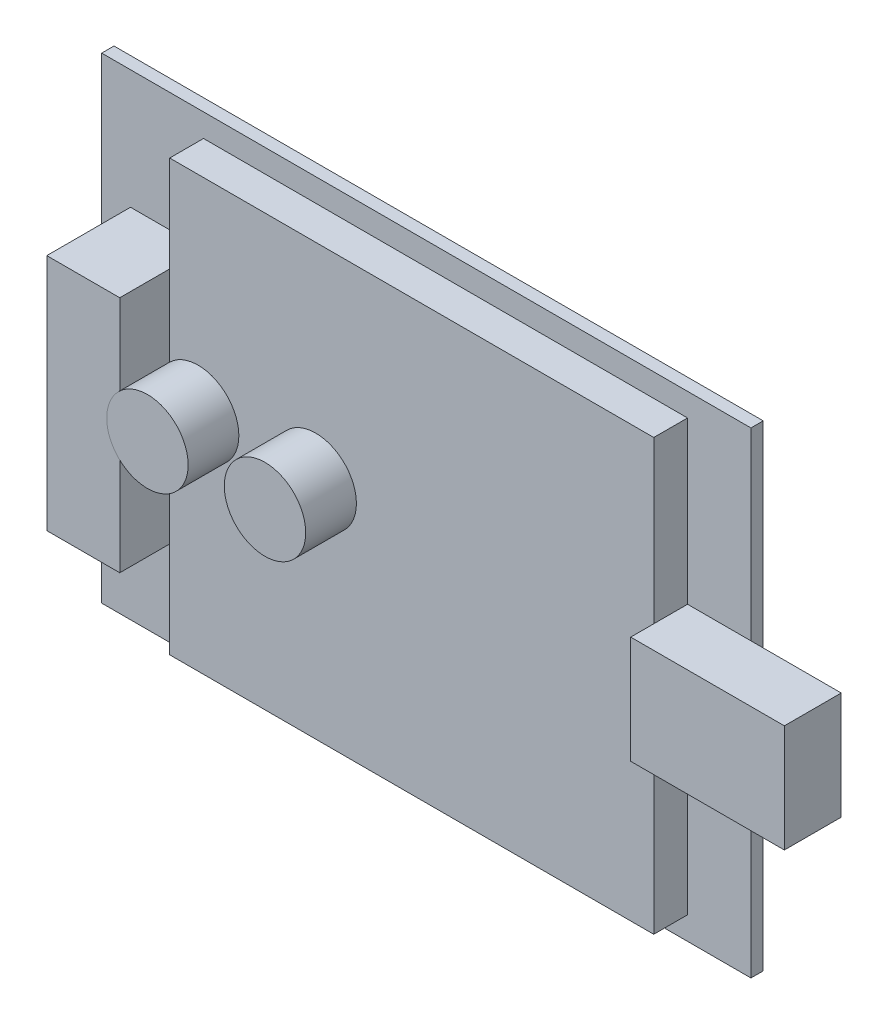
ISO-10303-21;
HEADER;
FILE_DESCRIPTION(('STEP AP214'),'2;1');
FILE_NAME('part.step','',(''),(''),'','','');
FILE_SCHEMA(('AUTOMOTIVE_DESIGN { 1 0 10303 214 1 1 1 1 }'));
ENDSEC;
DATA;
#1=APPLICATION_CONTEXT('core data for automotive mechanical design processes');
#2=APPLICATION_PROTOCOL_DEFINITION('international standard','automotive_design',2000,#1);
#3=PRODUCT_CONTEXT('',#1,'mechanical');
#4=PRODUCT('Part','Part','',(#3));
#5=PRODUCT_RELATED_PRODUCT_CATEGORY('part','',(#4));
#6=PRODUCT_DEFINITION_FORMATION('','',#4);
#7=PRODUCT_DEFINITION_CONTEXT('part definition',#1,'design');
#8=PRODUCT_DEFINITION('design','',#6,#7);
#9=PRODUCT_DEFINITION_SHAPE('','',#8);
#10=(LENGTH_UNIT() NAMED_UNIT(*) SI_UNIT(.MILLI.,.METRE.));
#11=(NAMED_UNIT(*) PLANE_ANGLE_UNIT() SI_UNIT($,.RADIAN.));
#12=(NAMED_UNIT(*) SI_UNIT($,.STERADIAN.) SOLID_ANGLE_UNIT());
#13=UNCERTAINTY_MEASURE_WITH_UNIT(LENGTH_MEASURE(1.E-05),#10,'distance_accuracy_value','');
#14=(GEOMETRIC_REPRESENTATION_CONTEXT(3) GLOBAL_UNCERTAINTY_ASSIGNED_CONTEXT((#13)) GLOBAL_UNIT_ASSIGNED_CONTEXT((#10,
#11,#12)) REPRESENTATION_CONTEXT('',''));
#15=CARTESIAN_POINT('',(0.,0.,0.));
#16=DIRECTION('',(0.,0.,1.));
#17=DIRECTION('',(1.,0.,0.));
#18=AXIS2_PLACEMENT_3D('',#15,#16,#17);
#19=CARTESIAN_POINT('',(-29.,-15.5,12.5));
#20=DIRECTION('',(-1.,0.,0.));
#21=DIRECTION('',(0.,0.,1.));
#22=AXIS2_PLACEMENT_3D('',#19,#20,#21);
#23=PLANE('',#22);
#24=DIRECTION('',(0.,0.,-1.));
#25=VECTOR('',#24,1.);
#26=CARTESIAN_POINT('',(-29.,4.99473319220205,12.6));
#27=LINE('',#26,#25);
#28=CARTESIAN_POINT('',(-29.,4.99473319220205,6.));
#29=VERTEX_POINT('',#28);
#30=CARTESIAN_POINT('',(-29.,4.99473319220205,12.5));
#31=VERTEX_POINT('',#30);
#32=EDGE_CURVE('E210',#29,#31,#27,.F.);
#33=ORIENTED_EDGE('',*,*,#32,.F.);
#34=DIRECTION('',(0.,-1.,0.));
#35=VECTOR('',#34,1.);
#36=CARTESIAN_POINT('',(-29.,28.,6.));
#37=LINE('',#36,#35);
#38=CARTESIAN_POINT('',(-29.,15.5,6.));
#39=VERTEX_POINT('',#38);
#40=EDGE_CURVE('E216',#39,#29,#37,.T.);
#41=ORIENTED_EDGE('',*,*,#40,.F.);
#42=DIRECTION('',(0.,0.,-1.));
#43=VECTOR('',#42,1.);
#44=CARTESIAN_POINT('',(-29.,15.5,12.5));
#45=LINE('',#44,#43);
#46=CARTESIAN_POINT('',(-29.,15.5,12.5));
#47=VERTEX_POINT('',#46);
#48=EDGE_CURVE('E311',#47,#39,#45,.T.);
#49=ORIENTED_EDGE('',*,*,#48,.F.);
#50=DIRECTION('',(0.,1.,0.));
#51=VECTOR('',#50,1.);
#52=CARTESIAN_POINT('',(-29.,-15.5,12.5));
#53=LINE('',#52,#51);
#54=EDGE_CURVE('E217',#31,#47,#53,.T.);
#55=ORIENTED_EDGE('',*,*,#54,.F.);
#56=EDGE_LOOP('',(#33,#41,#49,#55));
#57=FACE_BOUND('',#56,.T.);
#58=ADVANCED_FACE('F39',(#57),#23,.F.);
#59=DIRECTION('',(0.,0.,-1.));
#60=VECTOR('',#59,1.);
#61=CARTESIAN_POINT('',(-29.,-2.59473319220205,12.6));
#62=LINE('',#61,#60);
#63=CARTESIAN_POINT('',(-29.,-2.59473319220205,12.5));
#64=VERTEX_POINT('',#63);
#65=CARTESIAN_POINT('',(-29.,-2.59473319220205,6.));
#66=VERTEX_POINT('',#65);
#67=EDGE_CURVE('E54',#64,#66,#62,.T.);
#68=ORIENTED_EDGE('',*,*,#67,.F.);
#69=CARTESIAN_POINT('',(-29.,-15.5,12.5));
#70=VERTEX_POINT('',#69);
#71=EDGE_CURVE('E299',#70,#64,#53,.T.);
#72=ORIENTED_EDGE('',*,*,#71,.F.);
#73=DIRECTION('',(0.,0.,-1.));
#74=VECTOR('',#73,1.);
#75=CARTESIAN_POINT('',(-29.,-15.5,12.5));
#76=LINE('',#75,#74);
#77=CARTESIAN_POINT('',(-29.,-15.5,6.));
#78=VERTEX_POINT('',#77);
#79=EDGE_CURVE('E316',#70,#78,#76,.T.);
#80=ORIENTED_EDGE('',*,*,#79,.T.);
#81=EDGE_CURVE('E223',#66,#78,#37,.T.);
#82=ORIENTED_EDGE('',*,*,#81,.F.);
#83=EDGE_LOOP('',(#68,#72,#80,#82));
#84=FACE_BOUND('',#83,.T.);
#85=ADVANCED_FACE('F428',(#84),#23,.F.);
#86=CARTESIAN_POINT('',(34.,-28.,6.));
#87=DIRECTION('',(-1.,0.,0.));
#88=DIRECTION('',(0.,0.,1.));
#89=AXIS2_PLACEMENT_3D('',#86,#87,#88);
#90=PLANE('',#89);
#91=DIRECTION('',(0.,0.,-1.));
#92=VECTOR('',#91,1.);
#93=CARTESIAN_POINT('',(34.,-7.,9.));
#94=LINE('',#93,#92);
#95=CARTESIAN_POINT('',(34.,-7.,6.));
#96=VERTEX_POINT('',#95);
#97=CARTESIAN_POINT('',(34.,-7.,1.6));
#98=VERTEX_POINT('',#97);
#99=EDGE_CURVE('E366',#96,#98,#94,.T.);
#100=ORIENTED_EDGE('',*,*,#99,.F.);
#101=DIRECTION('',(0.,1.,0.));
#102=VECTOR('',#101,1.);
#103=CARTESIAN_POINT('',(34.,-28.,6.));
#104=LINE('',#103,#102);
#105=CARTESIAN_POINT('',(34.,-28.,6.));
#106=VERTEX_POINT('',#105);
#107=EDGE_CURVE('E504',#106,#96,#104,.T.);
#108=ORIENTED_EDGE('',*,*,#107,.F.);
#109=DIRECTION('',(0.,0.,-1.));
#110=VECTOR('',#109,1.);
#111=CARTESIAN_POINT('',(34.,-28.,6.));
#112=LINE('',#111,#110);
#113=CARTESIAN_POINT('',(34.,-28.,1.6));
#114=VERTEX_POINT('',#113);
#115=EDGE_CURVE('E253',#106,#114,#112,.T.);
#116=ORIENTED_EDGE('',*,*,#115,.T.);
#117=DIRECTION('',(0.,1.,0.));
#118=VECTOR('',#117,1.);
#119=CARTESIAN_POINT('',(34.,-28.,1.6));
#120=LINE('',#119,#118);
#121=EDGE_CURVE('E233',#114,#98,#120,.T.);
#122=ORIENTED_EDGE('',*,*,#121,.T.);
#123=EDGE_LOOP('',(#100,#108,#116,#122));
#124=FACE_BOUND('',#123,.T.);
#125=ADVANCED_FACE('F432',(#124),#90,.F.);
#126=CARTESIAN_POINT('',(-42.25,31.,1.6));
#127=DIRECTION('',(1.,0.,0.));
#128=DIRECTION('',(0.,0.,-1.));
#129=AXIS2_PLACEMENT_3D('',#126,#127,#128);
#130=PLANE('',#129);
#131=DIRECTION('',(0.,-1.,0.));
#132=VECTOR('',#131,1.);
#133=CARTESIAN_POINT('',(-42.25,31.,0.));
#134=LINE('',#133,#132);
#135=CARTESIAN_POINT('',(-42.25,31.,0.));
#136=VERTEX_POINT('',#135);
#137=CARTESIAN_POINT('',(-42.25,-31.,0.));
#138=VERTEX_POINT('',#137);
#139=EDGE_CURVE('E325',#136,#138,#134,.T.);
#140=ORIENTED_EDGE('',*,*,#139,.T.);
#141=DIRECTION('',(0.,0.,-1.));
#142=VECTOR('',#141,1.);
#143=CARTESIAN_POINT('',(-42.25,-31.,1.6));
#144=LINE('',#143,#142);
#145=CARTESIAN_POINT('',(-42.25,-31.,1.6));
#146=VERTEX_POINT('',#145);
#147=EDGE_CURVE('E354',#146,#138,#144,.T.);
#148=ORIENTED_EDGE('',*,*,#147,.F.);
#149=DIRECTION('',(0.,-1.,0.));
#150=VECTOR('',#149,1.);
#151=CARTESIAN_POINT('',(-42.25,31.,1.6));
#152=LINE('',#151,#150);
#153=CARTESIAN_POINT('',(-42.25,31.,1.6));
#154=VERTEX_POINT('',#153);
#155=EDGE_CURVE('E323',#154,#146,#152,.T.);
#156=ORIENTED_EDGE('',*,*,#155,.F.);
#157=DIRECTION('',(0.,0.,-1.));
#158=VECTOR('',#157,1.);
#159=CARTESIAN_POINT('',(-42.25,31.,1.6));
#160=LINE('',#159,#158);
#161=EDGE_CURVE('E338',#154,#136,#160,.T.);
#162=ORIENTED_EDGE('',*,*,#161,.T.);
#163=EDGE_LOOP('',(#140,#148,#156,#162));
#164=FACE_BOUND('',#163,.T.);
#165=ADVANCED_FACE('F41',(#164),#130,.F.);
#166=CARTESIAN_POINT('',(-42.25,-31.,1.6));
#167=DIRECTION('',(0.,1.,0.));
#168=DIRECTION('',(0.,0.,1.));
#169=AXIS2_PLACEMENT_3D('',#166,#167,#168);
#170=PLANE('',#169);
#171=DIRECTION('',(1.,0.,0.));
#172=VECTOR('',#171,1.);
#173=CARTESIAN_POINT('',(-42.25,-31.,0.));
#174=LINE('',#173,#172);
#175=CARTESIAN_POINT('',(42.25,-31.,0.));
#176=VERTEX_POINT('',#175);
#177=EDGE_CURVE('E340',#138,#176,#174,.T.);
#178=ORIENTED_EDGE('',*,*,#177,.T.);
#179=DIRECTION('',(0.,0.,-1.));
#180=VECTOR('',#179,1.);
#181=CARTESIAN_POINT('',(42.25,-31.,1.6));
#182=LINE('',#181,#180);
#183=CARTESIAN_POINT('',(42.25,-31.,1.6));
#184=VERTEX_POINT('',#183);
#185=EDGE_CURVE('E349',#184,#176,#182,.T.);
#186=ORIENTED_EDGE('',*,*,#185,.F.);
#187=DIRECTION('',(1.,0.,0.));
#188=VECTOR('',#187,1.);
#189=CARTESIAN_POINT('',(-42.25,-31.,1.6));
#190=LINE('',#189,#188);
#191=EDGE_CURVE('E326',#146,#184,#190,.T.);
#192=ORIENTED_EDGE('',*,*,#191,.F.);
#193=ORIENTED_EDGE('',*,*,#147,.T.);
#194=EDGE_LOOP('',(#178,#186,#192,#193));
#195=FACE_BOUND('',#194,.T.);
#196=ADVANCED_FACE('F464',(#195),#170,.F.);
#197=CARTESIAN_POINT('',(42.25,-31.,1.6));
#198=DIRECTION('',(-1.,0.,0.));
#199=DIRECTION('',(0.,0.,1.));
#200=AXIS2_PLACEMENT_3D('',#197,#198,#199);
#201=PLANE('',#200);
#202=DIRECTION('',(0.,1.,0.));
#203=VECTOR('',#202,1.);
#204=CARTESIAN_POINT('',(42.25,-31.,0.));
#205=LINE('',#204,#203);
#206=CARTESIAN_POINT('',(42.25,31.,0.));
#207=VERTEX_POINT('',#206);
#208=EDGE_CURVE('E341',#176,#207,#205,.T.);
#209=ORIENTED_EDGE('',*,*,#208,.T.);
#210=DIRECTION('',(0.,0.,-1.));
#211=VECTOR('',#210,1.);
#212=CARTESIAN_POINT('',(42.25,31.,1.6));
#213=LINE('',#212,#211);
#214=CARTESIAN_POINT('',(42.25,31.,1.6));
#215=VERTEX_POINT('',#214);
#216=EDGE_CURVE('E347',#215,#207,#213,.T.);
#217=ORIENTED_EDGE('',*,*,#216,.F.);
#218=DIRECTION('',(0.,1.,0.));
#219=VECTOR('',#218,1.);
#220=CARTESIAN_POINT('',(42.25,-31.,1.6));
#221=LINE('',#220,#219);
#222=CARTESIAN_POINT('',(42.25,7.,1.6));
#223=VERTEX_POINT('',#222);
#224=EDGE_CURVE('E328',#223,#215,#221,.T.);
#225=ORIENTED_EDGE('',*,*,#224,.F.);
#226=CARTESIAN_POINT('',(42.25,-7.,1.6));
#227=VERTEX_POINT('',#226);
#228=EDGE_CURVE('E331',#227,#223,#221,.T.);
#229=ORIENTED_EDGE('',*,*,#228,.F.);
#230=EDGE_CURVE('E329',#184,#227,#221,.T.);
#231=ORIENTED_EDGE('',*,*,#230,.F.);
#232=ORIENTED_EDGE('',*,*,#185,.T.);
#233=EDGE_LOOP('',(#209,#217,#225,#229,#231,#232));
#234=FACE_BOUND('',#233,.T.);
#235=ADVANCED_FACE('F459',(#234),#201,.F.);
#236=CARTESIAN_POINT('',(42.25,31.,1.6));
#237=DIRECTION('',(0.,-1.,0.));
#238=DIRECTION('',(0.,0.,-1.));
#239=AXIS2_PLACEMENT_3D('',#236,#237,#238);
#240=PLANE('',#239);
#241=DIRECTION('',(-1.,0.,0.));
#242=VECTOR('',#241,1.);
#243=CARTESIAN_POINT('',(42.25,31.,0.));
#244=LINE('',#243,#242);
#245=EDGE_CURVE('E330',#207,#136,#244,.T.);
#246=ORIENTED_EDGE('',*,*,#245,.T.);
#247=ORIENTED_EDGE('',*,*,#161,.F.);
#248=DIRECTION('',(-1.,0.,0.));
#249=VECTOR('',#248,1.);
#250=CARTESIAN_POINT('',(42.25,31.,1.6));
#251=LINE('',#250,#249);
#252=EDGE_CURVE('E334',#215,#154,#251,.T.);
#253=ORIENTED_EDGE('',*,*,#252,.F.);
#254=ORIENTED_EDGE('',*,*,#216,.T.);
#255=EDGE_LOOP('',(#246,#247,#253,#254));
#256=FACE_BOUND('',#255,.T.);
#257=ADVANCED_FACE('F455',(#256),#240,.F.);
#258=CARTESIAN_POINT('',(0.,0.,1.6));
#259=DIRECTION('',(0.,0.,1.));
#260=DIRECTION('',(1.,0.,0.));
#261=AXIS2_PLACEMENT_3D('',#258,#259,#260);
#262=PLANE('',#261);
#263=DIRECTION('',(-1.,0.,0.));
#264=VECTOR('',#263,1.);
#265=CARTESIAN_POINT('',(54.,7.,1.6));
#266=LINE('',#265,#264);
#267=CARTESIAN_POINT('',(34.,7.,1.6));
#268=VERTEX_POINT('',#267);
#269=EDGE_CURVE('E64',#223,#268,#266,.T.);
#270=ORIENTED_EDGE('',*,*,#269,.F.);
#271=ORIENTED_EDGE('',*,*,#224,.T.);
#272=ORIENTED_EDGE('',*,*,#252,.T.);
#273=ORIENTED_EDGE('',*,*,#155,.T.);
#274=ORIENTED_EDGE('',*,*,#191,.T.);
#275=ORIENTED_EDGE('',*,*,#230,.T.);
#276=DIRECTION('',(1.,0.,0.));
#277=VECTOR('',#276,1.);
#278=CARTESIAN_POINT('',(34.,-7.,1.6));
#279=LINE('',#278,#277);
#280=EDGE_CURVE('E389',#98,#227,#279,.T.);
#281=ORIENTED_EDGE('',*,*,#280,.F.);
#282=ORIENTED_EDGE('',*,*,#121,.F.);
#283=DIRECTION('',(1.,0.,0.));
#284=VECTOR('',#283,1.);
#285=CARTESIAN_POINT('',(-29.,-28.,1.6));
#286=LINE('',#285,#284);
#287=CARTESIAN_POINT('',(-29.,-28.,1.6));
#288=VERTEX_POINT('',#287);
#289=EDGE_CURVE('E362',#288,#114,#286,.T.);
#290=ORIENTED_EDGE('',*,*,#289,.F.);
#291=DIRECTION('',(0.,-1.,0.));
#292=VECTOR('',#291,1.);
#293=CARTESIAN_POINT('',(-29.,28.,1.6));
#294=LINE('',#293,#292);
#295=CARTESIAN_POINT('',(-29.,-15.5,1.6));
#296=VERTEX_POINT('',#295);
#297=EDGE_CURVE('E48',#296,#288,#294,.T.);
#298=ORIENTED_EDGE('',*,*,#297,.F.);
#299=DIRECTION('',(1.,0.,0.));
#300=VECTOR('',#299,1.);
#301=CARTESIAN_POINT('',(-38.5,-15.5,1.6));
#302=LINE('',#301,#300);
#303=CARTESIAN_POINT('',(-38.5,-15.5,1.6));
#304=VERTEX_POINT('',#303);
#305=EDGE_CURVE('E304',#304,#296,#302,.T.);
#306=ORIENTED_EDGE('',*,*,#305,.F.);
#307=DIRECTION('',(0.,-1.,0.));
#308=VECTOR('',#307,1.);
#309=CARTESIAN_POINT('',(-38.5,15.5,1.6));
#310=LINE('',#309,#308);
#311=CARTESIAN_POINT('',(-38.5,15.5,1.6));
#312=VERTEX_POINT('',#311);
#313=EDGE_CURVE('E289',#312,#304,#310,.T.);
#314=ORIENTED_EDGE('',*,*,#313,.F.);
#315=DIRECTION('',(-1.,0.,0.));
#316=VECTOR('',#315,1.);
#317=CARTESIAN_POINT('',(-29.,15.5,1.6));
#318=LINE('',#317,#316);
#319=CARTESIAN_POINT('',(-29.,15.5,1.6));
#320=VERTEX_POINT('',#319);
#321=EDGE_CURVE('E293',#320,#312,#318,.T.);
#322=ORIENTED_EDGE('',*,*,#321,.F.);
#323=CARTESIAN_POINT('',(-29.,28.,1.6));
#324=VERTEX_POINT('',#323);
#325=EDGE_CURVE('E360',#324,#320,#294,.T.);
#326=ORIENTED_EDGE('',*,*,#325,.F.);
#327=DIRECTION('',(-1.,0.,0.));
#328=VECTOR('',#327,1.);
#329=CARTESIAN_POINT('',(34.,28.,1.6));
#330=LINE('',#329,#328);
#331=CARTESIAN_POINT('',(34.,28.,1.6));
#332=VERTEX_POINT('',#331);
#333=EDGE_CURVE('E231',#332,#324,#330,.T.);
#334=ORIENTED_EDGE('',*,*,#333,.F.);
#335=EDGE_CURVE('E244',#268,#332,#120,.T.);
#336=ORIENTED_EDGE('',*,*,#335,.F.);
#337=EDGE_LOOP('',(#270,#271,#272,#273,#274,#275,#281,#282,#290,#298,#306,#314,#322,#326,#334,#336));
#338=FACE_BOUND('',#337,.T.);
#339=ADVANCED_FACE('F450',(#338),#262,.T.);
#340=CARTESIAN_POINT('',(0.,0.,0.));
#341=DIRECTION('',(0.,0.,1.));
#342=DIRECTION('',(1.,0.,0.));
#343=AXIS2_PLACEMENT_3D('',#340,#341,#342);
#344=PLANE('',#343);
#345=DIRECTION('',(-1.,0.,0.));
#346=VECTOR('',#345,1.);
#347=CARTESIAN_POINT('',(-29.,15.5,0.));
#348=LINE('',#347,#346);
#349=CARTESIAN_POINT('',(-29.,15.5,0.));
#350=VERTEX_POINT('',#349);
#351=CARTESIAN_POINT('',(-38.5,15.5,0.));
#352=VERTEX_POINT('',#351);
#353=EDGE_CURVE('E268',#350,#352,#348,.T.);
#354=ORIENTED_EDGE('',*,*,#353,.T.);
#355=DIRECTION('',(0.,-1.,0.));
#356=VECTOR('',#355,1.);
#357=CARTESIAN_POINT('',(-38.5,15.5,0.));
#358=LINE('',#357,#356);
#359=CARTESIAN_POINT('',(-38.5,-15.5,0.));
#360=VERTEX_POINT('',#359);
#361=EDGE_CURVE('E256',#352,#360,#358,.T.);
#362=ORIENTED_EDGE('',*,*,#361,.T.);
#363=DIRECTION('',(1.,0.,0.));
#364=VECTOR('',#363,1.);
#365=CARTESIAN_POINT('',(-38.5,-15.5,0.));
#366=LINE('',#365,#364);
#367=CARTESIAN_POINT('',(-29.,-15.5,0.));
#368=VERTEX_POINT('',#367);
#369=EDGE_CURVE('E261',#360,#368,#366,.T.);
#370=ORIENTED_EDGE('',*,*,#369,.T.);
#371=DIRECTION('',(0.,1.,0.));
#372=VECTOR('',#371,1.);
#373=CARTESIAN_POINT('',(-29.,-15.5,0.));
#374=LINE('',#373,#372);
#375=EDGE_CURVE('E264',#368,#350,#374,.T.);
#376=ORIENTED_EDGE('',*,*,#375,.T.);
#377=EDGE_LOOP('',(#354,#362,#370,#376));
#378=FACE_BOUND('',#377,.T.);
#379=ORIENTED_EDGE('',*,*,#139,.F.);
#380=ORIENTED_EDGE('',*,*,#245,.F.);
#381=ORIENTED_EDGE('',*,*,#208,.F.);
#382=ORIENTED_EDGE('',*,*,#177,.F.);
#383=EDGE_LOOP('',(#379,#380,#381,#382));
#384=FACE_BOUND('',#383,.T.);
#385=ADVANCED_FACE('F449',(#378,#384),#344,.F.);
#386=CARTESIAN_POINT('',(-38.5,15.5,12.5));
#387=DIRECTION('',(1.,0.,0.));
#388=DIRECTION('',(0.,0.,-1.));
#389=AXIS2_PLACEMENT_3D('',#386,#387,#388);
#390=PLANE('',#389);
#391=ORIENTED_EDGE('',*,*,#313,.T.);
#392=DIRECTION('',(0.,0.,-1.));
#393=VECTOR('',#392,1.);
#394=CARTESIAN_POINT('',(-38.5,-15.5,12.5));
#395=LINE('',#394,#393);
#396=CARTESIAN_POINT('',(-38.5,-15.5,12.5));
#397=VERTEX_POINT('',#396);
#398=EDGE_CURVE('E317',#397,#304,#395,.T.);
#399=ORIENTED_EDGE('',*,*,#398,.F.);
#400=DIRECTION('',(0.,-1.,0.));
#401=VECTOR('',#400,1.);
#402=CARTESIAN_POINT('',(-38.5,15.5,12.5));
#403=LINE('',#402,#401);
#404=CARTESIAN_POINT('',(-38.5,15.5,12.5));
#405=VERTEX_POINT('',#404);
#406=EDGE_CURVE('E292',#405,#397,#403,.T.);
#407=ORIENTED_EDGE('',*,*,#406,.F.);
#408=DIRECTION('',(0.,0.,-1.));
#409=VECTOR('',#408,1.);
#410=CARTESIAN_POINT('',(-38.5,15.5,12.5));
#411=LINE('',#410,#409);
#412=EDGE_CURVE('E305',#405,#312,#411,.T.);
#413=ORIENTED_EDGE('',*,*,#412,.T.);
#414=EDGE_LOOP('',(#391,#399,#407,#413));
#415=FACE_BOUND('',#414,.T.);
#416=ADVANCED_FACE('F444',(#415),#390,.F.);
#417=CARTESIAN_POINT('',(-38.5,-15.5,12.5));
#418=DIRECTION('',(0.,1.,0.));
#419=DIRECTION('',(0.,0.,1.));
#420=AXIS2_PLACEMENT_3D('',#417,#418,#419);
#421=PLANE('',#420);
#422=ORIENTED_EDGE('',*,*,#305,.T.);
#423=EDGE_CURVE('E312',#78,#296,#76,.T.);
#424=ORIENTED_EDGE('',*,*,#423,.F.);
#425=ORIENTED_EDGE('',*,*,#79,.F.);
#426=DIRECTION('',(1.,0.,0.));
#427=VECTOR('',#426,1.);
#428=CARTESIAN_POINT('',(-38.5,-15.5,12.5));
#429=LINE('',#428,#427);
#430=EDGE_CURVE('E294',#397,#70,#429,.T.);
#431=ORIENTED_EDGE('',*,*,#430,.F.);
#432=ORIENTED_EDGE('',*,*,#398,.T.);
#433=EDGE_LOOP('',(#422,#424,#425,#431,#432));
#434=FACE_BOUND('',#433,.T.);
#435=ADVANCED_FACE('F439',(#434),#421,.F.);
#436=CARTESIAN_POINT('',(-29.,15.5,12.5));
#437=DIRECTION('',(0.,-1.,0.));
#438=DIRECTION('',(0.,0.,-1.));
#439=AXIS2_PLACEMENT_3D('',#436,#437,#438);
#440=PLANE('',#439);
#441=ORIENTED_EDGE('',*,*,#321,.T.);
#442=ORIENTED_EDGE('',*,*,#412,.F.);
#443=DIRECTION('',(-1.,0.,0.));
#444=VECTOR('',#443,1.);
#445=CARTESIAN_POINT('',(-29.,15.5,12.5));
#446=LINE('',#445,#444);
#447=EDGE_CURVE('E296',#47,#405,#446,.T.);
#448=ORIENTED_EDGE('',*,*,#447,.F.);
#449=ORIENTED_EDGE('',*,*,#48,.T.);
#450=EDGE_CURVE('E315',#39,#320,#45,.T.);
#451=ORIENTED_EDGE('',*,*,#450,.T.);
#452=EDGE_LOOP('',(#441,#442,#448,#449,#451));
#453=FACE_BOUND('',#452,.T.);
#454=ADVANCED_FACE('F437',(#453),#440,.F.);
#455=CARTESIAN_POINT('',(0.,0.,12.5));
#456=DIRECTION('',(0.,0.,1.));
#457=DIRECTION('',(1.,0.,0.));
#458=AXIS2_PLACEMENT_3D('',#455,#456,#457);
#459=PLANE('',#458);
#460=ORIENTED_EDGE('',*,*,#71,.T.);
#461=CARTESIAN_POINT('',(-25.3,1.2,12.5));
#462=DIRECTION('',(0.,0.,1.));
#463=DIRECTION('',(1.,0.,0.));
#464=AXIS2_PLACEMENT_3D('',#461,#462,#463);
#465=CIRCLE('',#464,5.3);
#466=EDGE_CURVE('E218',#64,#31,#465,.F.);
#467=ORIENTED_EDGE('',*,*,#466,.T.);
#468=ORIENTED_EDGE('',*,*,#54,.T.);
#469=ORIENTED_EDGE('',*,*,#447,.T.);
#470=ORIENTED_EDGE('',*,*,#406,.T.);
#471=ORIENTED_EDGE('',*,*,#430,.T.);
#472=EDGE_LOOP('',(#460,#467,#468,#469,#470,#471));
#473=FACE_BOUND('',#472,.T.);
#474=ADVANCED_FACE('F572',(#473),#459,.T.);
#475=CARTESIAN_POINT('',(-38.5,15.5,0.));
#476=DIRECTION('',(1.,0.,0.));
#477=DIRECTION('',(0.,0.,-1.));
#478=AXIS2_PLACEMENT_3D('',#475,#476,#477);
#479=PLANE('',#478);
#480=DIRECTION('',(0.,-1.,0.));
#481=VECTOR('',#480,1.);
#482=CARTESIAN_POINT('',(-38.5,15.5,-2.5));
#483=LINE('',#482,#481);
#484=CARTESIAN_POINT('',(-38.5,15.5,-2.5));
#485=VERTEX_POINT('',#484);
#486=CARTESIAN_POINT('',(-38.5,-15.5,-2.5));
#487=VERTEX_POINT('',#486);
#488=EDGE_CURVE('E260',#485,#487,#483,.T.);
#489=ORIENTED_EDGE('',*,*,#488,.T.);
#490=DIRECTION('',(0.,0.,-1.));
#491=VECTOR('',#490,1.);
#492=CARTESIAN_POINT('',(-38.5,-15.5,0.));
#493=LINE('',#492,#491);
#494=EDGE_CURVE('E290',#360,#487,#493,.T.);
#495=ORIENTED_EDGE('',*,*,#494,.F.);
#496=ORIENTED_EDGE('',*,*,#361,.F.);
#497=DIRECTION('',(0.,0.,-1.));
#498=VECTOR('',#497,1.);
#499=CARTESIAN_POINT('',(-38.5,15.5,0.));
#500=LINE('',#499,#498);
#501=EDGE_CURVE('E271',#352,#485,#500,.T.);
#502=ORIENTED_EDGE('',*,*,#501,.T.);
#503=EDGE_LOOP('',(#489,#495,#496,#502));
#504=FACE_BOUND('',#503,.T.);
#505=ADVANCED_FACE('F568',(#504),#479,.F.);
#506=CARTESIAN_POINT('',(-38.5,-15.5,0.));
#507=DIRECTION('',(0.,1.,0.));
#508=DIRECTION('',(0.,0.,1.));
#509=AXIS2_PLACEMENT_3D('',#506,#507,#508);
#510=PLANE('',#509);
#511=DIRECTION('',(1.,0.,0.));
#512=VECTOR('',#511,1.);
#513=CARTESIAN_POINT('',(-38.5,-15.5,-2.5));
#514=LINE('',#513,#512);
#515=CARTESIAN_POINT('',(-29.,-15.5,-2.5));
#516=VERTEX_POINT('',#515);
#517=EDGE_CURVE('E273',#487,#516,#514,.T.);
#518=ORIENTED_EDGE('',*,*,#517,.T.);
#519=DIRECTION('',(0.,0.,-1.));
#520=VECTOR('',#519,1.);
#521=CARTESIAN_POINT('',(-29.,-15.5,0.));
#522=LINE('',#521,#520);
#523=EDGE_CURVE('E285',#368,#516,#522,.T.);
#524=ORIENTED_EDGE('',*,*,#523,.F.);
#525=ORIENTED_EDGE('',*,*,#369,.F.);
#526=ORIENTED_EDGE('',*,*,#494,.T.);
#527=EDGE_LOOP('',(#518,#524,#525,#526));
#528=FACE_BOUND('',#527,.T.);
#529=ADVANCED_FACE('F567',(#528),#510,.F.);
#530=CARTESIAN_POINT('',(-29.,-15.5,0.));
#531=DIRECTION('',(-1.,0.,0.));
#532=DIRECTION('',(0.,0.,1.));
#533=AXIS2_PLACEMENT_3D('',#530,#531,#532);
#534=PLANE('',#533);
#535=DIRECTION('',(0.,1.,0.));
#536=VECTOR('',#535,1.);
#537=CARTESIAN_POINT('',(-29.,-15.5,-2.5));
#538=LINE('',#537,#536);
#539=CARTESIAN_POINT('',(-29.,15.5,-2.5));
#540=VERTEX_POINT('',#539);
#541=EDGE_CURVE('E277',#516,#540,#538,.T.);
#542=ORIENTED_EDGE('',*,*,#541,.T.);
#543=DIRECTION('',(0.,0.,-1.));
#544=VECTOR('',#543,1.);
#545=CARTESIAN_POINT('',(-29.,15.5,0.));
#546=LINE('',#545,#544);
#547=EDGE_CURVE('E283',#350,#540,#546,.T.);
#548=ORIENTED_EDGE('',*,*,#547,.F.);
#549=ORIENTED_EDGE('',*,*,#375,.F.);
#550=ORIENTED_EDGE('',*,*,#523,.T.);
#551=EDGE_LOOP('',(#542,#548,#549,#550));
#552=FACE_BOUND('',#551,.T.);
#553=ADVANCED_FACE('F565',(#552),#534,.F.);
#554=CARTESIAN_POINT('',(-29.,15.5,0.));
#555=DIRECTION('',(0.,-1.,0.));
#556=DIRECTION('',(0.,0.,-1.));
#557=AXIS2_PLACEMENT_3D('',#554,#555,#556);
#558=PLANE('',#557);
#559=DIRECTION('',(-1.,0.,0.));
#560=VECTOR('',#559,1.);
#561=CARTESIAN_POINT('',(-29.,15.5,-2.5));
#562=LINE('',#561,#560);
#563=EDGE_CURVE('E265',#540,#485,#562,.T.);
#564=ORIENTED_EDGE('',*,*,#563,.T.);
#565=ORIENTED_EDGE('',*,*,#501,.F.);
#566=ORIENTED_EDGE('',*,*,#353,.F.);
#567=ORIENTED_EDGE('',*,*,#547,.T.);
#568=EDGE_LOOP('',(#564,#565,#566,#567));
#569=FACE_BOUND('',#568,.T.);
#570=ADVANCED_FACE('F557',(#569),#558,.F.);
#571=CARTESIAN_POINT('',(0.,0.,-2.5));
#572=DIRECTION('',(0.,0.,1.));
#573=DIRECTION('',(1.,0.,0.));
#574=AXIS2_PLACEMENT_3D('',#571,#572,#573);
#575=PLANE('',#574);
#576=ORIENTED_EDGE('',*,*,#488,.F.);
#577=ORIENTED_EDGE('',*,*,#563,.F.);
#578=ORIENTED_EDGE('',*,*,#541,.F.);
#579=ORIENTED_EDGE('',*,*,#517,.F.);
#580=EDGE_LOOP('',(#576,#577,#578,#579));
#581=FACE_BOUND('',#580,.T.);
#582=ADVANCED_FACE('F553',(#581),#575,.F.);
#583=CARTESIAN_POINT('',(-29.,28.,6.));
#584=DIRECTION('',(1.,0.,0.));
#585=DIRECTION('',(0.,0.,-1.));
#586=AXIS2_PLACEMENT_3D('',#583,#584,#585);
#587=PLANE('',#586);
#588=CARTESIAN_POINT('',(-29.,-28.,6.));
#589=VERTEX_POINT('',#588);
#590=EDGE_CURVE('E229',#78,#589,#37,.T.);
#591=ORIENTED_EDGE('',*,*,#590,.F.);
#592=ORIENTED_EDGE('',*,*,#423,.T.);
#593=ORIENTED_EDGE('',*,*,#297,.T.);
#594=DIRECTION('',(0.,0.,-1.));
#595=VECTOR('',#594,1.);
#596=CARTESIAN_POINT('',(-29.,-28.,6.));
#597=LINE('',#596,#595);
#598=EDGE_CURVE('E255',#589,#288,#597,.T.);
#599=ORIENTED_EDGE('',*,*,#598,.F.);
#600=EDGE_LOOP('',(#591,#592,#593,#599));
#601=FACE_BOUND('',#600,.T.);
#602=ADVANCED_FACE('F551',(#601),#587,.F.);
#603=ORIENTED_EDGE('',*,*,#450,.F.);
#604=CARTESIAN_POINT('',(-29.,28.,6.));
#605=VERTEX_POINT('',#604);
#606=EDGE_CURVE('E221',#605,#39,#37,.T.);
#607=ORIENTED_EDGE('',*,*,#606,.F.);
#608=DIRECTION('',(0.,0.,-1.));
#609=VECTOR('',#608,1.);
#610=CARTESIAN_POINT('',(-29.,28.,6.));
#611=LINE('',#610,#609);
#612=EDGE_CURVE('E246',#605,#324,#611,.T.);
#613=ORIENTED_EDGE('',*,*,#612,.T.);
#614=ORIENTED_EDGE('',*,*,#325,.T.);
#615=EDGE_LOOP('',(#603,#607,#613,#614));
#616=FACE_BOUND('',#615,.T.);
#617=ADVANCED_FACE('F511',(#616),#587,.F.);
#618=CARTESIAN_POINT('',(-29.,-28.,6.));
#619=DIRECTION('',(0.,1.,0.));
#620=DIRECTION('',(0.,0.,1.));
#621=AXIS2_PLACEMENT_3D('',#618,#619,#620);
#622=PLANE('',#621);
#623=ORIENTED_EDGE('',*,*,#289,.T.);
#624=ORIENTED_EDGE('',*,*,#115,.F.);
#625=DIRECTION('',(1.,0.,0.));
#626=VECTOR('',#625,1.);
#627=CARTESIAN_POINT('',(-29.,-28.,6.));
#628=LINE('',#627,#626);
#629=EDGE_CURVE('E227',#589,#106,#628,.T.);
#630=ORIENTED_EDGE('',*,*,#629,.F.);
#631=ORIENTED_EDGE('',*,*,#598,.T.);
#632=EDGE_LOOP('',(#623,#624,#630,#631));
#633=FACE_BOUND('',#632,.T.);
#634=ADVANCED_FACE('F505',(#633),#622,.F.);
#635=CARTESIAN_POINT('',(34.,7.,6.));
#636=VERTEX_POINT('',#635);
#637=CARTESIAN_POINT('',(34.,28.,6.));
#638=VERTEX_POINT('',#637);
#639=EDGE_CURVE('E525',#636,#638,#104,.T.);
#640=ORIENTED_EDGE('',*,*,#639,.F.);
#641=DIRECTION('',(0.,0.,-1.));
#642=VECTOR('',#641,1.);
#643=CARTESIAN_POINT('',(34.,7.,9.));
#644=LINE('',#643,#642);
#645=EDGE_CURVE('E385',#636,#268,#644,.T.);
#646=ORIENTED_EDGE('',*,*,#645,.T.);
#647=ORIENTED_EDGE('',*,*,#335,.T.);
#648=DIRECTION('',(0.,0.,-1.));
#649=VECTOR('',#648,1.);
#650=CARTESIAN_POINT('',(34.,28.,6.));
#651=LINE('',#650,#649);
#652=EDGE_CURVE('E247',#638,#332,#651,.T.);
#653=ORIENTED_EDGE('',*,*,#652,.F.);
#654=EDGE_LOOP('',(#640,#646,#647,#653));
#655=FACE_BOUND('',#654,.T.);
#656=ADVANCED_FACE('F517',(#655),#90,.F.);
#657=CARTESIAN_POINT('',(34.,28.,6.));
#658=DIRECTION('',(0.,-1.,0.));
#659=DIRECTION('',(0.,0.,-1.));
#660=AXIS2_PLACEMENT_3D('',#657,#658,#659);
#661=PLANE('',#660);
#662=ORIENTED_EDGE('',*,*,#333,.T.);
#663=ORIENTED_EDGE('',*,*,#612,.F.);
#664=DIRECTION('',(-1.,0.,0.));
#665=VECTOR('',#664,1.);
#666=CARTESIAN_POINT('',(34.,28.,6.));
#667=LINE('',#666,#665);
#668=EDGE_CURVE('E248',#638,#605,#667,.T.);
#669=ORIENTED_EDGE('',*,*,#668,.F.);
#670=ORIENTED_EDGE('',*,*,#652,.T.);
#671=EDGE_LOOP('',(#662,#663,#669,#670));
#672=FACE_BOUND('',#671,.T.);
#673=ADVANCED_FACE('F520',(#672),#661,.F.);
#674=CARTESIAN_POINT('',(0.,0.,6.));
#675=DIRECTION('',(0.,0.,1.));
#676=DIRECTION('',(1.,0.,0.));
#677=AXIS2_PLACEMENT_3D('',#674,#675,#676);
#678=PLANE('',#677);
#679=CARTESIAN_POINT('',(-10.,1.2,6.));
#680=DIRECTION('',(0.,0.,1.));
#681=DIRECTION('',(1.,0.,0.));
#682=AXIS2_PLACEMENT_3D('',#679,#680,#681);
#683=CIRCLE('',#682,5.3);
#684=CARTESIAN_POINT('',(-4.7,1.2,6.));
#685=VERTEX_POINT('',#684);
#686=EDGE_CURVE('E43',#685,#685,#683,.F.);
#687=ORIENTED_EDGE('',*,*,#686,.T.);
#688=EDGE_LOOP('',(#687));
#689=FACE_BOUND('',#688,.T.);
#690=ORIENTED_EDGE('',*,*,#40,.T.);
#691=CARTESIAN_POINT('',(-25.3,1.2,6.));
#692=DIRECTION('',(0.,0.,1.));
#693=DIRECTION('',(1.,0.,0.));
#694=AXIS2_PLACEMENT_3D('',#691,#692,#693);
#695=CIRCLE('',#694,5.3);
#696=EDGE_CURVE('E11',#29,#66,#695,.F.);
#697=ORIENTED_EDGE('',*,*,#696,.T.);
#698=ORIENTED_EDGE('',*,*,#81,.T.);
#699=ORIENTED_EDGE('',*,*,#590,.T.);
#700=ORIENTED_EDGE('',*,*,#629,.T.);
#701=ORIENTED_EDGE('',*,*,#107,.T.);
#702=EDGE_CURVE('E516',#96,#636,#104,.T.);
#703=ORIENTED_EDGE('',*,*,#702,.T.);
#704=ORIENTED_EDGE('',*,*,#639,.T.);
#705=ORIENTED_EDGE('',*,*,#668,.T.);
#706=ORIENTED_EDGE('',*,*,#606,.T.);
#707=EDGE_LOOP('',(#690,#697,#698,#699,#700,#701,#703,#704,#705,#706));
#708=FACE_BOUND('',#707,.T.);
#709=ADVANCED_FACE('F225',(#689,#708),#678,.T.);
#710=CARTESIAN_POINT('',(0.,0.,1.6));
#711=DIRECTION('',(0.,0.,1.));
#712=DIRECTION('',(1.,0.,0.));
#713=AXIS2_PLACEMENT_3D('',#710,#711,#712);
#714=PLANE('',#713);
#715=CARTESIAN_POINT('',(54.,-7.,1.6));
#716=VERTEX_POINT('',#715);
#717=EDGE_CURVE('E393',#227,#716,#279,.T.);
#718=ORIENTED_EDGE('',*,*,#717,.F.);
#719=ORIENTED_EDGE('',*,*,#228,.T.);
#720=CARTESIAN_POINT('',(54.,7.,1.6));
#721=VERTEX_POINT('',#720);
#722=EDGE_CURVE('E382',#721,#223,#266,.T.);
#723=ORIENTED_EDGE('',*,*,#722,.F.);
#724=DIRECTION('',(0.,1.,0.));
#725=VECTOR('',#724,1.);
#726=CARTESIAN_POINT('',(54.,-7.,1.6));
#727=LINE('',#726,#725);
#728=EDGE_CURVE('E387',#716,#721,#727,.T.);
#729=ORIENTED_EDGE('',*,*,#728,.F.);
#730=EDGE_LOOP('',(#718,#719,#723,#729));
#731=FACE_BOUND('',#730,.T.);
#732=ADVANCED_FACE('F482',(#731),#714,.F.);
#733=CARTESIAN_POINT('',(34.,7.,9.));
#734=DIRECTION('',(1.,0.,0.));
#735=DIRECTION('',(0.,0.,-1.));
#736=AXIS2_PLACEMENT_3D('',#733,#734,#735);
#737=PLANE('',#736);
#738=ORIENTED_EDGE('',*,*,#702,.F.);
#739=CARTESIAN_POINT('',(34.,-7.,9.));
#740=VERTEX_POINT('',#739);
#741=EDGE_CURVE('E361',#740,#96,#94,.T.);
#742=ORIENTED_EDGE('',*,*,#741,.F.);
#743=DIRECTION('',(0.,-1.,0.));
#744=VECTOR('',#743,1.);
#745=CARTESIAN_POINT('',(34.,7.,9.));
#746=LINE('',#745,#744);
#747=CARTESIAN_POINT('',(34.,7.,9.));
#748=VERTEX_POINT('',#747);
#749=EDGE_CURVE('E384',#748,#740,#746,.T.);
#750=ORIENTED_EDGE('',*,*,#749,.F.);
#751=EDGE_CURVE('E377',#748,#636,#644,.T.);
#752=ORIENTED_EDGE('',*,*,#751,.T.);
#753=EDGE_LOOP('',(#738,#742,#750,#752));
#754=FACE_BOUND('',#753,.T.);
#755=ADVANCED_FACE('F524',(#754),#737,.F.);
#756=CARTESIAN_POINT('',(34.,-7.,9.));
#757=DIRECTION('',(0.,1.,0.));
#758=DIRECTION('',(0.,0.,1.));
#759=AXIS2_PLACEMENT_3D('',#756,#757,#758);
#760=PLANE('',#759);
#761=ORIENTED_EDGE('',*,*,#280,.T.);
#762=ORIENTED_EDGE('',*,*,#717,.T.);
#763=DIRECTION('',(0.,0.,-1.));
#764=VECTOR('',#763,1.);
#765=CARTESIAN_POINT('',(54.,-7.,9.));
#766=LINE('',#765,#764);
#767=CARTESIAN_POINT('',(54.,-7.,9.));
#768=VERTEX_POINT('',#767);
#769=EDGE_CURVE('E375',#768,#716,#766,.T.);
#770=ORIENTED_EDGE('',*,*,#769,.F.);
#771=DIRECTION('',(1.,0.,0.));
#772=VECTOR('',#771,1.);
#773=CARTESIAN_POINT('',(34.,-7.,9.));
#774=LINE('',#773,#772);
#775=EDGE_CURVE('E396',#740,#768,#774,.T.);
#776=ORIENTED_EDGE('',*,*,#775,.F.);
#777=ORIENTED_EDGE('',*,*,#741,.T.);
#778=ORIENTED_EDGE('',*,*,#99,.T.);
#779=EDGE_LOOP('',(#761,#762,#770,#776,#777,#778));
#780=FACE_BOUND('',#779,.T.);
#781=ADVANCED_FACE('F493',(#780),#760,.F.);
#782=CARTESIAN_POINT('',(54.,-7.,9.));
#783=DIRECTION('',(-1.,0.,0.));
#784=DIRECTION('',(0.,0.,1.));
#785=AXIS2_PLACEMENT_3D('',#782,#783,#784);
#786=PLANE('',#785);
#787=ORIENTED_EDGE('',*,*,#728,.T.);
#788=DIRECTION('',(0.,0.,-1.));
#789=VECTOR('',#788,1.);
#790=CARTESIAN_POINT('',(54.,7.,9.));
#791=LINE('',#790,#789);
#792=CARTESIAN_POINT('',(54.,7.,9.));
#793=VERTEX_POINT('',#792);
#794=EDGE_CURVE('E376',#793,#721,#791,.T.);
#795=ORIENTED_EDGE('',*,*,#794,.F.);
#796=DIRECTION('',(0.,1.,0.));
#797=VECTOR('',#796,1.);
#798=CARTESIAN_POINT('',(54.,-7.,9.));
#799=LINE('',#798,#797);
#800=EDGE_CURVE('E395',#768,#793,#799,.T.);
#801=ORIENTED_EDGE('',*,*,#800,.F.);
#802=ORIENTED_EDGE('',*,*,#769,.T.);
#803=EDGE_LOOP('',(#787,#795,#801,#802));
#804=FACE_BOUND('',#803,.T.);
#805=ADVANCED_FACE('F495',(#804),#786,.F.);
#806=CARTESIAN_POINT('',(54.,7.,9.));
#807=DIRECTION('',(0.,-1.,0.));
#808=DIRECTION('',(0.,0.,-1.));
#809=AXIS2_PLACEMENT_3D('',#806,#807,#808);
#810=PLANE('',#809);
#811=ORIENTED_EDGE('',*,*,#722,.T.);
#812=ORIENTED_EDGE('',*,*,#269,.T.);
#813=ORIENTED_EDGE('',*,*,#645,.F.);
#814=ORIENTED_EDGE('',*,*,#751,.F.);
#815=DIRECTION('',(-1.,0.,0.));
#816=VECTOR('',#815,1.);
#817=CARTESIAN_POINT('',(54.,7.,9.));
#818=LINE('',#817,#816);
#819=EDGE_CURVE('E394',#793,#748,#818,.T.);
#820=ORIENTED_EDGE('',*,*,#819,.F.);
#821=ORIENTED_EDGE('',*,*,#794,.T.);
#822=EDGE_LOOP('',(#811,#812,#813,#814,#820,#821));
#823=FACE_BOUND('',#822,.T.);
#824=ADVANCED_FACE('F486',(#823),#810,.F.);
#825=CARTESIAN_POINT('',(0.,0.,9.));
#826=DIRECTION('',(0.,0.,1.));
#827=DIRECTION('',(1.,0.,0.));
#828=AXIS2_PLACEMENT_3D('',#825,#826,#827);
#829=PLANE('',#828);
#830=ORIENTED_EDGE('',*,*,#749,.T.);
#831=ORIENTED_EDGE('',*,*,#775,.T.);
#832=ORIENTED_EDGE('',*,*,#800,.T.);
#833=ORIENTED_EDGE('',*,*,#819,.T.);
#834=EDGE_LOOP('',(#830,#831,#832,#833));
#835=FACE_BOUND('',#834,.T.);
#836=ADVANCED_FACE('F526',(#835),#829,.T.);
#837=CARTESIAN_POINT('',(-25.3,1.2,12.6));
#838=DIRECTION('',(0.,0.,-1.));
#839=DIRECTION('',(-1.,0.,0.));
#840=AXIS2_PLACEMENT_3D('',#837,#838,#839);
#841=CYLINDRICAL_SURFACE('',#840,5.3);
#842=ORIENTED_EDGE('',*,*,#466,.F.);
#843=ORIENTED_EDGE('',*,*,#67,.T.);
#844=ORIENTED_EDGE('',*,*,#696,.F.);
#845=ORIENTED_EDGE('',*,*,#32,.T.);
#846=EDGE_LOOP('',(#842,#843,#844,#845));
#847=FACE_BOUND('',#846,.T.);
#848=CARTESIAN_POINT('',(-25.3,1.2,12.6));
#849=DIRECTION('',(0.,0.,1.));
#850=DIRECTION('',(1.,0.,0.));
#851=AXIS2_PLACEMENT_3D('',#848,#849,#850);
#852=CIRCLE('',#851,5.3);
#853=CARTESIAN_POINT('',(-20.,1.2,12.6));
#854=VERTEX_POINT('',#853);
#855=EDGE_CURVE('E405',#854,#854,#852,.T.);
#856=ORIENTED_EDGE('',*,*,#855,.F.);
#857=EDGE_LOOP('',(#856));
#858=FACE_BOUND('',#857,.T.);
#859=ADVANCED_FACE('F202',(#847,#858),#841,.T.);
#860=CARTESIAN_POINT('',(-25.3,1.2,12.6));
#861=DIRECTION('',(0.,0.,1.));
#862=DIRECTION('',(1.,0.,0.));
#863=AXIS2_PLACEMENT_3D('',#860,#861,#862);
#864=PLANE('',#863);
#865=ORIENTED_EDGE('',*,*,#855,.T.);
#866=EDGE_LOOP('',(#865));
#867=FACE_BOUND('',#866,.T.);
#868=ADVANCED_FACE('F417',(#867),#864,.T.);
#869=CARTESIAN_POINT('',(-10.,1.2,12.6));
#870=DIRECTION('',(0.,0.,-1.));
#871=DIRECTION('',(-1.,0.,0.));
#872=AXIS2_PLACEMENT_3D('',#869,#870,#871);
#873=CYLINDRICAL_SURFACE('',#872,5.3);
#874=ORIENTED_EDGE('',*,*,#686,.F.);
#875=EDGE_LOOP('',(#874));
#876=FACE_BOUND('',#875,.T.);
#877=CARTESIAN_POINT('',(-10.,1.2,12.6));
#878=DIRECTION('',(0.,0.,1.));
#879=DIRECTION('',(1.,0.,0.));
#880=AXIS2_PLACEMENT_3D('',#877,#878,#879);
#881=CIRCLE('',#880,5.3);
#882=CARTESIAN_POINT('',(-4.7,1.2,12.6));
#883=VERTEX_POINT('',#882);
#884=EDGE_CURVE('E403',#883,#883,#881,.T.);
#885=ORIENTED_EDGE('',*,*,#884,.F.);
#886=EDGE_LOOP('',(#885));
#887=FACE_BOUND('',#886,.T.);
#888=ADVANCED_FACE('F412',(#876,#887),#873,.T.);
#889=CARTESIAN_POINT('',(-10.,1.2,12.6));
#890=DIRECTION('',(0.,0.,1.));
#891=DIRECTION('',(1.,0.,0.));
#892=AXIS2_PLACEMENT_3D('',#889,#890,#891);
#893=PLANE('',#892);
#894=ORIENTED_EDGE('',*,*,#884,.T.);
#895=EDGE_LOOP('',(#894));
#896=FACE_BOUND('',#895,.T.);
#897=ADVANCED_FACE('F418',(#896),#893,.T.);
#898=CLOSED_SHELL('',(#58,#85,#125,#165,#196,#235,#257,#339,#385,#416,#435,#454,#474,#505,#529,
#553,#570,#582,#602,#617,#634,#656,#673,#709,#732,#755,#781,#805,#824,#836,#859,#868,#888,#897));
#899=MANIFOLD_SOLID_BREP('B2',#898);
#900=ADVANCED_BREP_SHAPE_REPRESENTATION('',(#18,#899),#14);
#901=SHAPE_DEFINITION_REPRESENTATION(#9,#900);
ENDSEC;
END-ISO-10303-21;
